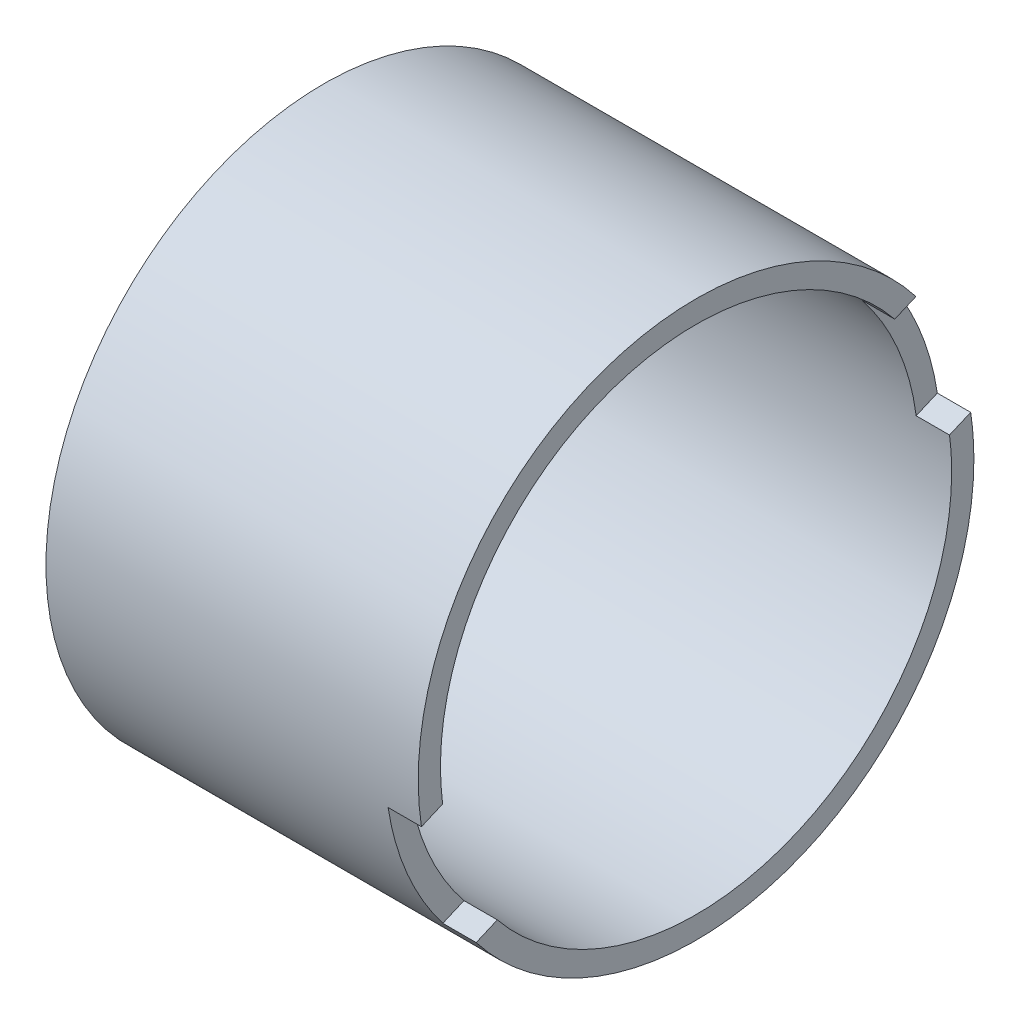
ISO-10303-21;
HEADER;
FILE_DESCRIPTION(('STEP AP214'),'2;1');
FILE_NAME('part.step','',(''),(''),'','','');
FILE_SCHEMA(('AUTOMOTIVE_DESIGN { 1 0 10303 214 1 1 1 1 }'));
ENDSEC;
DATA;
#1=APPLICATION_CONTEXT('core data for automotive mechanical design processes');
#2=APPLICATION_PROTOCOL_DEFINITION('international standard','automotive_design',2000,#1);
#3=PRODUCT_CONTEXT('',#1,'mechanical');
#4=PRODUCT('Part','Part','',(#3));
#5=PRODUCT_RELATED_PRODUCT_CATEGORY('part','',(#4));
#6=PRODUCT_DEFINITION_FORMATION('','',#4);
#7=PRODUCT_DEFINITION_CONTEXT('part definition',#1,'design');
#8=PRODUCT_DEFINITION('design','',#6,#7);
#9=PRODUCT_DEFINITION_SHAPE('','',#8);
#10=(LENGTH_UNIT() NAMED_UNIT(*) SI_UNIT(.MILLI.,.METRE.));
#11=(NAMED_UNIT(*) PLANE_ANGLE_UNIT() SI_UNIT($,.RADIAN.));
#12=(NAMED_UNIT(*) SI_UNIT($,.STERADIAN.) SOLID_ANGLE_UNIT());
#13=UNCERTAINTY_MEASURE_WITH_UNIT(LENGTH_MEASURE(1.E-05),#10,'distance_accuracy_value','');
#14=(GEOMETRIC_REPRESENTATION_CONTEXT(3) GLOBAL_UNCERTAINTY_ASSIGNED_CONTEXT((#13)) GLOBAL_UNIT_ASSIGNED_CONTEXT((#10,
#11,#12)) REPRESENTATION_CONTEXT('',''));
#15=CARTESIAN_POINT('',(0.,0.,0.));
#16=DIRECTION('',(0.,0.,1.));
#17=DIRECTION('',(1.,0.,0.));
#18=AXIS2_PLACEMENT_3D('',#15,#16,#17);
#19=CARTESIAN_POINT('',(52.83,0.,4.8));
#20=DIRECTION('',(1.,0.,0.));
#21=DIRECTION('',(0.,0.,-1.));
#22=AXIS2_PLACEMENT_3D('',#19,#20,#21);
#23=PLANE('',#22);
#24=CARTESIAN_POINT('',(52.83,0.,0.));
#25=DIRECTION('',(1.,0.,0.));
#26=DIRECTION('',(0.,0.,-1.));
#27=AXIS2_PLACEMENT_3D('',#24,#25,#26);
#28=CIRCLE('',#27,4.6);
#29=CARTESIAN_POINT('',(52.83,0.595024774524707,-4.56135347432117));
#30=VERTEX_POINT('',#29);
#31=CARTESIAN_POINT('',(52.83,-2.89286312258762,3.57649870040136));
#32=VERTEX_POINT('',#31);
#33=EDGE_CURVE('E83',#30,#32,#28,.F.);
#34=ORIENTED_EDGE('',*,*,#33,.T.);
#35=DIRECTION('',(0.,-0.393941909582387,0.919135339258905));
#36=VECTOR('',#35,1.);
#37=CARTESIAN_POINT('',(52.83,-1.14891917401193,-0.492427387005473));
#38=LINE('',#37,#36);
#39=CARTESIAN_POINT('',(52.83,-3.05608224301829,3.95731744037654));
#40=VERTEX_POINT('',#39);
#41=EDGE_CURVE('E85',#40,#32,#38,.F.);
#42=ORIENTED_EDGE('',*,*,#41,.F.);
#43=CARTESIAN_POINT('',(52.83,0.,0.));
#44=DIRECTION('',(1.,0.,0.));
#45=DIRECTION('',(0.,0.,-1.));
#46=AXIS2_PLACEMENT_3D('',#43,#44,#45);
#47=CIRCLE('',#46,5.);
#48=CARTESIAN_POINT('',(52.83,0.758243894955372,-4.94217221429635));
#49=VERTEX_POINT('',#48);
#50=EDGE_CURVE('E33',#49,#40,#47,.F.);
#51=ORIENTED_EDGE('',*,*,#50,.F.);
#52=DIRECTION('',(0.,-0.393941909582387,0.919135339258905));
#53=VECTOR('',#52,1.);
#54=CARTESIAN_POINT('',(52.83,-1.14891917401193,-0.492427387005473));
#55=LINE('',#54,#53);
#56=EDGE_CURVE('E87',#30,#49,#55,.F.);
#57=ORIENTED_EDGE('',*,*,#56,.F.);
#58=EDGE_LOOP('',(#34,#42,#51,#57));
#59=FACE_BOUND('',#58,.T.);
#60=ADVANCED_FACE('F17',(#59),#23,.T.);
#61=CARTESIAN_POINT('',(52.53,-1.14891917401193,-0.492427387005473));
#62=DIRECTION('',(0.,0.919135339258905,0.393941909582387));
#63=DIRECTION('',(0.,-0.393941909582387,0.919135339258905));
#64=AXIS2_PLACEMENT_3D('',#61,#62,#63);
#65=PLANE('',#64);
#66=DIRECTION('',(1.,0.,0.));
#67=VECTOR('',#66,1.);
#68=CARTESIAN_POINT('',(49.48,-3.05608224301829,3.95731744037654));
#69=LINE('',#68,#67);
#70=CARTESIAN_POINT('',(52.23,-3.05608224301829,3.95731744037654));
#71=VERTEX_POINT('',#70);
#72=EDGE_CURVE('E98',#40,#71,#69,.F.);
#73=ORIENTED_EDGE('',*,*,#72,.F.);
#74=ORIENTED_EDGE('',*,*,#41,.T.);
#75=DIRECTION('',(1.,0.,0.));
#76=VECTOR('',#75,1.);
#77=CARTESIAN_POINT('',(49.48,-2.89286312258762,3.57649870040136));
#78=LINE('',#77,#76);
#79=CARTESIAN_POINT('',(52.23,-2.89286312258762,3.57649870040136));
#80=VERTEX_POINT('',#79);
#81=EDGE_CURVE('E95',#32,#80,#78,.F.);
#82=ORIENTED_EDGE('',*,*,#81,.T.);
#83=DIRECTION('',(0.,0.393941909582385,-0.919135339258906));
#84=VECTOR('',#83,1.);
#85=CARTESIAN_POINT('',(52.23,-3.05608224301829,3.95731744037654));
#86=LINE('',#85,#84);
#87=EDGE_CURVE('E99',#71,#80,#86,.T.);
#88=ORIENTED_EDGE('',*,*,#87,.F.);
#89=EDGE_LOOP('',(#73,#74,#82,#88));
#90=FACE_BOUND('',#89,.T.);
#91=ADVANCED_FACE('F94',(#90),#65,.T.);
#92=CARTESIAN_POINT('',(52.23,6.16990902813086E-11,-2.74900102681386E-11));
#93=DIRECTION('',(1.,0.,0.));
#94=DIRECTION('',(0.,0.,-1.));
#95=AXIS2_PLACEMENT_3D('',#92,#93,#94);
#96=PLANE('',#95);
#97=CARTESIAN_POINT('',(52.23,0.,0.));
#98=DIRECTION('',(1.,0.,0.));
#99=DIRECTION('',(0.,0.,-1.));
#100=AXIS2_PLACEMENT_3D('',#97,#98,#99);
#101=CIRCLE('',#100,5.);
#102=CARTESIAN_POINT('',(52.23,-0.758243894861696,4.94217221431072));
#103=VERTEX_POINT('',#102);
#104=EDGE_CURVE('E122',#71,#103,#101,.F.);
#105=ORIENTED_EDGE('',*,*,#104,.F.);
#106=ORIENTED_EDGE('',*,*,#87,.T.);
#107=CARTESIAN_POINT('',(52.23,0.,0.));
#108=DIRECTION('',(1.,0.,0.));
#109=DIRECTION('',(0.,0.,-1.));
#110=AXIS2_PLACEMENT_3D('',#107,#108,#109);
#111=CIRCLE('',#110,4.6);
#112=CARTESIAN_POINT('',(52.23,-0.595024774430155,4.56135347433351));
#113=VERTEX_POINT('',#112);
#114=EDGE_CURVE('E20',#80,#113,#111,.F.);
#115=ORIENTED_EDGE('',*,*,#114,.T.);
#116=DIRECTION('',(0.,0.393941909582387,-0.919135339258905));
#117=VECTOR('',#116,1.);
#118=CARTESIAN_POINT('',(52.23,1.14891917413533,0.492427386950493));
#119=LINE('',#118,#117);
#120=EDGE_CURVE('E104',#103,#113,#119,.T.);
#121=ORIENTED_EDGE('',*,*,#120,.F.);
#122=EDGE_LOOP('',(#105,#106,#115,#121));
#123=FACE_BOUND('',#122,.T.);
#124=ADVANCED_FACE('F186',(#123),#96,.T.);
#125=CARTESIAN_POINT('',(52.53,1.14891917413533,0.492427386950493));
#126=DIRECTION('',(0.,-0.919135339258905,-0.393941909582387));
#127=DIRECTION('',(0.,0.393941909582387,-0.919135339258905));
#128=AXIS2_PLACEMENT_3D('',#125,#126,#127);
#129=PLANE('',#128);
#130=DIRECTION('',(1.,0.,0.));
#131=VECTOR('',#130,1.);
#132=CARTESIAN_POINT('',(49.48,-0.758243894861694,4.94217221431072));
#133=LINE('',#132,#131);
#134=CARTESIAN_POINT('',(52.83,-0.758243894861695,4.94217221431072));
#135=VERTEX_POINT('',#134);
#136=EDGE_CURVE('E121',#103,#135,#133,.T.);
#137=ORIENTED_EDGE('',*,*,#136,.F.);
#138=ORIENTED_EDGE('',*,*,#120,.T.);
#139=DIRECTION('',(1.,0.,0.));
#140=VECTOR('',#139,1.);
#141=CARTESIAN_POINT('',(49.48,-0.595024774430152,4.56135347433351));
#142=LINE('',#141,#140);
#143=CARTESIAN_POINT('',(52.83,-0.595024774430153,4.56135347433351));
#144=VERTEX_POINT('',#143);
#145=EDGE_CURVE('E92',#113,#144,#142,.T.);
#146=ORIENTED_EDGE('',*,*,#145,.T.);
#147=DIRECTION('',(0.,0.393941909582393,-0.919135339258902));
#148=VECTOR('',#147,1.);
#149=CARTESIAN_POINT('',(52.83,-0.758243894861695,4.94217221431072));
#150=LINE('',#149,#148);
#151=EDGE_CURVE('E91',#135,#144,#150,.T.);
#152=ORIENTED_EDGE('',*,*,#151,.F.);
#153=EDGE_LOOP('',(#137,#138,#146,#152));
#154=FACE_BOUND('',#153,.T.);
#155=ADVANCED_FACE('F184',(#154),#129,.T.);
#156=CARTESIAN_POINT('',(49.48,0.,0.));
#157=DIRECTION('',(1.,0.,0.));
#158=DIRECTION('',(0.,0.,-1.));
#159=AXIS2_PLACEMENT_3D('',#156,#157,#158);
#160=CYLINDRICAL_SURFACE('',#159,4.6);
#161=CARTESIAN_POINT('',(46.13,0.,0.));
#162=DIRECTION('',(1.,0.,0.));
#163=DIRECTION('',(0.,0.,-1.));
#164=AXIS2_PLACEMENT_3D('',#161,#162,#163);
#165=CIRCLE('',#164,4.6);
#166=CARTESIAN_POINT('',(46.13,0.,-4.6));
#167=VERTEX_POINT('',#166);
#168=EDGE_CURVE('E118',#167,#167,#165,.T.);
#169=ORIENTED_EDGE('',*,*,#168,.F.);
#170=EDGE_LOOP('',(#169));
#171=FACE_BOUND('',#170,.T.);
#172=ORIENTED_EDGE('',*,*,#81,.F.);
#173=ORIENTED_EDGE('',*,*,#33,.F.);
#174=DIRECTION('',(1.,0.,0.));
#175=VECTOR('',#174,1.);
#176=CARTESIAN_POINT('',(52.53,0.595024774524706,-4.56135347432117));
#177=LINE('',#176,#175);
#178=CARTESIAN_POINT('',(52.23,0.595024774524707,-4.56135347432117));
#179=VERTEX_POINT('',#178);
#180=EDGE_CURVE('E146',#179,#30,#177,.T.);
#181=ORIENTED_EDGE('',*,*,#180,.F.);
#182=CARTESIAN_POINT('',(52.23,0.,0.));
#183=DIRECTION('',(1.,0.,0.));
#184=DIRECTION('',(0.,0.,-1.));
#185=AXIS2_PLACEMENT_3D('',#182,#183,#184);
#186=CIRCLE('',#185,4.6);
#187=CARTESIAN_POINT('',(52.23,2.89286312266176,-3.57649870034139));
#188=VERTEX_POINT('',#187);
#189=EDGE_CURVE('E126',#188,#179,#186,.F.);
#190=ORIENTED_EDGE('',*,*,#189,.F.);
#191=DIRECTION('',(1.,0.,0.));
#192=VECTOR('',#191,1.);
#193=CARTESIAN_POINT('',(52.53,2.89286312266176,-3.57649870034139));
#194=LINE('',#193,#192);
#195=CARTESIAN_POINT('',(52.83,2.89286312266176,-3.57649870034139));
#196=VERTEX_POINT('',#195);
#197=EDGE_CURVE('E132',#196,#188,#194,.F.);
#198=ORIENTED_EDGE('',*,*,#197,.F.);
#199=CARTESIAN_POINT('',(52.83,0.,0.));
#200=DIRECTION('',(1.,0.,0.));
#201=DIRECTION('',(0.,0.,-1.));
#202=AXIS2_PLACEMENT_3D('',#199,#200,#201);
#203=CIRCLE('',#202,4.6);
#204=EDGE_CURVE('E130',#144,#196,#203,.F.);
#205=ORIENTED_EDGE('',*,*,#204,.F.);
#206=ORIENTED_EDGE('',*,*,#145,.F.);
#207=ORIENTED_EDGE('',*,*,#114,.F.);
#208=EDGE_LOOP('',(#172,#173,#181,#190,#198,#205,#206,#207));
#209=FACE_BOUND('',#208,.T.);
#210=ADVANCED_FACE('F102',(#171,#209),#160,.F.);
#211=CARTESIAN_POINT('',(52.83,0.,4.8));
#212=DIRECTION('',(1.,0.,0.));
#213=DIRECTION('',(0.,0.,-1.));
#214=AXIS2_PLACEMENT_3D('',#211,#212,#213);
#215=PLANE('',#214);
#216=CARTESIAN_POINT('',(52.83,0.,0.));
#217=DIRECTION('',(1.,0.,0.));
#218=DIRECTION('',(0.,0.,-1.));
#219=AXIS2_PLACEMENT_3D('',#216,#217,#218);
#220=CIRCLE('',#219,5.);
#221=CARTESIAN_POINT('',(52.83,3.0560822430933,-3.95731744031861));
#222=VERTEX_POINT('',#221);
#223=EDGE_CURVE('E115',#135,#222,#220,.F.);
#224=ORIENTED_EDGE('',*,*,#223,.F.);
#225=ORIENTED_EDGE('',*,*,#151,.T.);
#226=ORIENTED_EDGE('',*,*,#204,.T.);
#227=DIRECTION('',(0.,0.393941909582387,-0.919135339258905));
#228=VECTOR('',#227,1.);
#229=CARTESIAN_POINT('',(52.83,1.14891917413533,0.492427386950493));
#230=LINE('',#229,#228);
#231=EDGE_CURVE('E129',#222,#196,#230,.F.);
#232=ORIENTED_EDGE('',*,*,#231,.F.);
#233=EDGE_LOOP('',(#224,#225,#226,#232));
#234=FACE_BOUND('',#233,.T.);
#235=ADVANCED_FACE('F197',(#234),#215,.T.);
#236=CARTESIAN_POINT('',(52.53,1.14891917413533,0.492427386950493));
#237=DIRECTION('',(0.,-0.919135339258905,-0.393941909582387));
#238=DIRECTION('',(0.,0.393941909582387,-0.919135339258905));
#239=AXIS2_PLACEMENT_3D('',#236,#237,#238);
#240=PLANE('',#239);
#241=DIRECTION('',(1.,0.,0.));
#242=VECTOR('',#241,1.);
#243=CARTESIAN_POINT('',(49.48,3.0560822430933,-3.95731744031861));
#244=LINE('',#243,#242);
#245=CARTESIAN_POINT('',(52.23,3.0560822430933,-3.95731744031861));
#246=VERTEX_POINT('',#245);
#247=EDGE_CURVE('E114',#222,#246,#244,.F.);
#248=ORIENTED_EDGE('',*,*,#247,.F.);
#249=ORIENTED_EDGE('',*,*,#231,.T.);
#250=ORIENTED_EDGE('',*,*,#197,.T.);
#251=DIRECTION('',(0.,-0.393941909582385,0.919135339258906));
#252=VECTOR('',#251,1.);
#253=CARTESIAN_POINT('',(52.23,3.0560822430933,-3.95731744031861));
#254=LINE('',#253,#252);
#255=EDGE_CURVE('E128',#246,#188,#254,.T.);
#256=ORIENTED_EDGE('',*,*,#255,.F.);
#257=EDGE_LOOP('',(#248,#249,#250,#256));
#258=FACE_BOUND('',#257,.T.);
#259=ADVANCED_FACE('F158',(#258),#240,.T.);
#260=CARTESIAN_POINT('',(52.23,6.16990902813086E-11,-2.74900102681386E-11));
#261=DIRECTION('',(1.,0.,0.));
#262=DIRECTION('',(0.,0.,-1.));
#263=AXIS2_PLACEMENT_3D('',#260,#261,#262);
#264=PLANE('',#263);
#265=CARTESIAN_POINT('',(52.23,0.,0.));
#266=DIRECTION('',(1.,0.,0.));
#267=DIRECTION('',(0.,0.,-1.));
#268=AXIS2_PLACEMENT_3D('',#265,#266,#267);
#269=CIRCLE('',#268,5.);
#270=CARTESIAN_POINT('',(52.23,0.758243894955372,-4.94217221429635));
#271=VERTEX_POINT('',#270);
#272=EDGE_CURVE('E111',#246,#271,#269,.F.);
#273=ORIENTED_EDGE('',*,*,#272,.F.);
#274=ORIENTED_EDGE('',*,*,#255,.T.);
#275=ORIENTED_EDGE('',*,*,#189,.T.);
#276=DIRECTION('',(0.,-0.393941909582387,0.919135339258905));
#277=VECTOR('',#276,1.);
#278=CARTESIAN_POINT('',(52.23,-1.14891917401193,-0.492427387005473));
#279=LINE('',#278,#277);
#280=EDGE_CURVE('E42',#271,#179,#279,.T.);
#281=ORIENTED_EDGE('',*,*,#280,.F.);
#282=EDGE_LOOP('',(#273,#274,#275,#281));
#283=FACE_BOUND('',#282,.T.);
#284=ADVANCED_FACE('F155',(#283),#264,.T.);
#285=CARTESIAN_POINT('',(52.53,-1.14891917401193,-0.492427387005473));
#286=DIRECTION('',(0.,0.919135339258905,0.393941909582387));
#287=DIRECTION('',(0.,-0.393941909582387,0.919135339258905));
#288=AXIS2_PLACEMENT_3D('',#285,#286,#287);
#289=PLANE('',#288);
#290=DIRECTION('',(1.,0.,0.));
#291=VECTOR('',#290,1.);
#292=CARTESIAN_POINT('',(49.48,0.758243894955369,-4.94217221429635));
#293=LINE('',#292,#291);
#294=EDGE_CURVE('E25',#271,#49,#293,.T.);
#295=ORIENTED_EDGE('',*,*,#294,.F.);
#296=ORIENTED_EDGE('',*,*,#280,.T.);
#297=ORIENTED_EDGE('',*,*,#180,.T.);
#298=ORIENTED_EDGE('',*,*,#56,.T.);
#299=EDGE_LOOP('',(#295,#296,#297,#298));
#300=FACE_BOUND('',#299,.T.);
#301=ADVANCED_FACE('F160',(#300),#289,.T.);
#302=CARTESIAN_POINT('',(46.13,0.,4.8));
#303=DIRECTION('',(-1.,0.,0.));
#304=DIRECTION('',(0.,0.,1.));
#305=AXIS2_PLACEMENT_3D('',#302,#303,#304);
#306=PLANE('',#305);
#307=ORIENTED_EDGE('',*,*,#168,.T.);
#308=EDGE_LOOP('',(#307));
#309=FACE_BOUND('',#308,.T.);
#310=CARTESIAN_POINT('',(46.13,0.,0.));
#311=DIRECTION('',(1.,0.,0.));
#312=DIRECTION('',(0.,0.,-1.));
#313=AXIS2_PLACEMENT_3D('',#310,#311,#312);
#314=CIRCLE('',#313,5.);
#315=CARTESIAN_POINT('',(46.13,0.,-5.));
#316=VERTEX_POINT('',#315);
#317=EDGE_CURVE('E11',#316,#316,#314,.T.);
#318=ORIENTED_EDGE('',*,*,#317,.F.);
#319=EDGE_LOOP('',(#318));
#320=FACE_BOUND('',#319,.T.);
#321=ADVANCED_FACE('F162',(#309,#320),#306,.T.);
#322=CARTESIAN_POINT('',(49.48,0.,0.));
#323=DIRECTION('',(1.,0.,0.));
#324=DIRECTION('',(0.,0.,-1.));
#325=AXIS2_PLACEMENT_3D('',#322,#323,#324);
#326=CYLINDRICAL_SURFACE('',#325,5.);
#327=ORIENTED_EDGE('',*,*,#136,.T.);
#328=ORIENTED_EDGE('',*,*,#223,.T.);
#329=ORIENTED_EDGE('',*,*,#247,.T.);
#330=ORIENTED_EDGE('',*,*,#272,.T.);
#331=ORIENTED_EDGE('',*,*,#294,.T.);
#332=ORIENTED_EDGE('',*,*,#50,.T.);
#333=ORIENTED_EDGE('',*,*,#72,.T.);
#334=ORIENTED_EDGE('',*,*,#104,.T.);
#335=EDGE_LOOP('',(#327,#328,#329,#330,#331,#332,#333,#334));
#336=FACE_BOUND('',#335,.T.);
#337=ORIENTED_EDGE('',*,*,#317,.T.);
#338=EDGE_LOOP('',(#337));
#339=FACE_BOUND('',#338,.T.);
#340=ADVANCED_FACE('F169',(#336,#339),#326,.T.);
#341=CLOSED_SHELL('',(#60,#91,#124,#155,#210,#235,#259,#284,#301,#321,#340));
#342=MANIFOLD_SOLID_BREP('B1',#341);
#343=ADVANCED_BREP_SHAPE_REPRESENTATION('',(#18,#342),#14);
#344=SHAPE_DEFINITION_REPRESENTATION(#9,#343);
ENDSEC;
END-ISO-10303-21;
